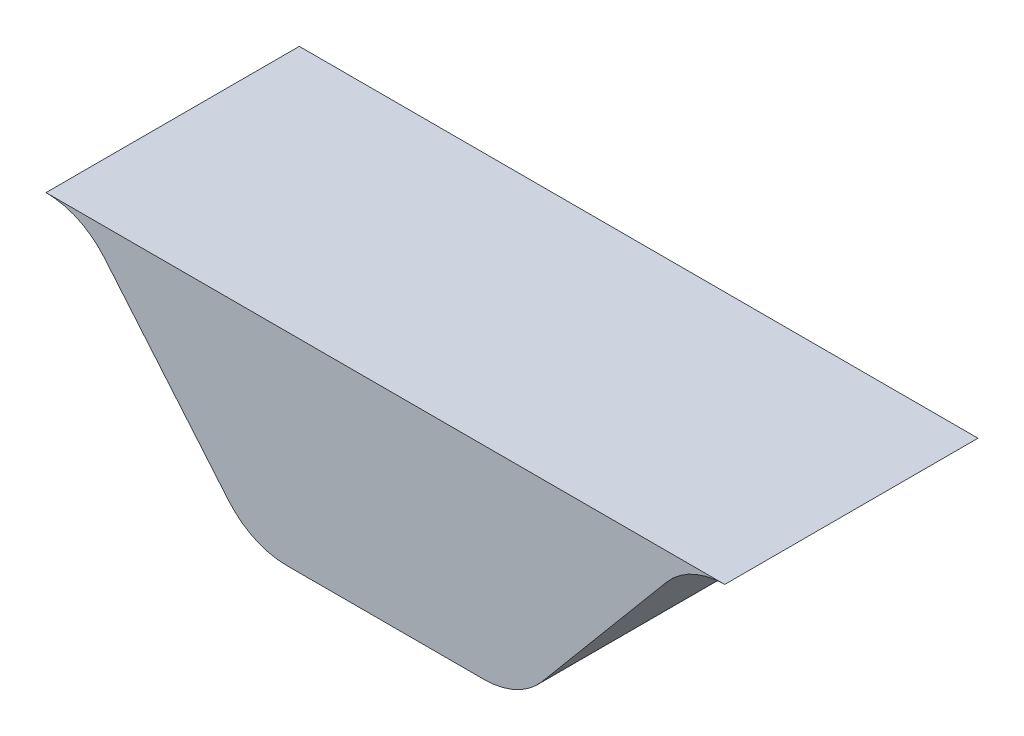
ISO-10303-21;
HEADER;
FILE_DESCRIPTION(('STEP AP214'),'2;1');
FILE_NAME('part.step','',(''),(''),'','','');
FILE_SCHEMA(('AUTOMOTIVE_DESIGN { 1 0 10303 214 1 1 1 1 }'));
ENDSEC;
DATA;
#1=APPLICATION_CONTEXT('core data for automotive mechanical design processes');
#2=APPLICATION_PROTOCOL_DEFINITION('international standard','automotive_design',2000,#1);
#3=PRODUCT_CONTEXT('',#1,'mechanical');
#4=PRODUCT('Part','Part','',(#3));
#5=PRODUCT_RELATED_PRODUCT_CATEGORY('part','',(#4));
#6=PRODUCT_DEFINITION_FORMATION('','',#4);
#7=PRODUCT_DEFINITION_CONTEXT('part definition',#1,'design');
#8=PRODUCT_DEFINITION('design','',#6,#7);
#9=PRODUCT_DEFINITION_SHAPE('','',#8);
#10=(LENGTH_UNIT() NAMED_UNIT(*) SI_UNIT(.MILLI.,.METRE.));
#11=(NAMED_UNIT(*) PLANE_ANGLE_UNIT() SI_UNIT($,.RADIAN.));
#12=(NAMED_UNIT(*) SI_UNIT($,.STERADIAN.) SOLID_ANGLE_UNIT());
#13=UNCERTAINTY_MEASURE_WITH_UNIT(LENGTH_MEASURE(1.E-05),#10,'distance_accuracy_value','');
#14=(GEOMETRIC_REPRESENTATION_CONTEXT(3) GLOBAL_UNCERTAINTY_ASSIGNED_CONTEXT((#13)) GLOBAL_UNIT_ASSIGNED_CONTEXT((#10,
#11,#12)) REPRESENTATION_CONTEXT('',''));
#15=CARTESIAN_POINT('',(0.,0.,0.));
#16=DIRECTION('',(0.,0.,1.));
#17=DIRECTION('',(1.,0.,0.));
#18=AXIS2_PLACEMENT_3D('',#15,#16,#17);
#19=CARTESIAN_POINT('',(2.64360147529084,-4.,2.5));
#20=DIRECTION('',(0.,1.,0.));
#21=DIRECTION('',(-1.,0.,0.));
#22=AXIS2_PLACEMENT_3D('',#19,#20,#21);
#23=PLANE('',#22);
#24=DIRECTION('',(1.,0.,0.));
#25=VECTOR('',#24,1.);
#26=CARTESIAN_POINT('',(2.64360147529084,-4.,-2.5));
#27=LINE('',#26,#25);
#28=CARTESIAN_POINT('',(-1.94413998805835,-4.,-2.5));
#29=VERTEX_POINT('',#28);
#30=CARTESIAN_POINT('',(1.94413998805835,-4.,-2.5));
#31=VERTEX_POINT('',#30);
#32=EDGE_CURVE('E164',#29,#31,#27,.T.);
#33=ORIENTED_EDGE('',*,*,#32,.T.);
#34=DIRECTION('',(0.,0.,-1.));
#35=VECTOR('',#34,1.);
#36=CARTESIAN_POINT('',(1.94413998805835,-4.,2.5));
#37=LINE('',#36,#35);
#38=CARTESIAN_POINT('',(1.94413998805835,-4.,2.5));
#39=VERTEX_POINT('',#38);
#40=EDGE_CURVE('E58',#31,#39,#37,.F.);
#41=ORIENTED_EDGE('',*,*,#40,.T.);
#42=DIRECTION('',(1.,0.,0.));
#43=VECTOR('',#42,1.);
#44=CARTESIAN_POINT('',(2.64360147529084,-4.,2.5));
#45=LINE('',#44,#43);
#46=CARTESIAN_POINT('',(-1.94413998805835,-4.,2.5));
#47=VERTEX_POINT('',#46);
#48=EDGE_CURVE('E170',#47,#39,#45,.T.);
#49=ORIENTED_EDGE('',*,*,#48,.F.);
#50=DIRECTION('',(0.,0.,-1.));
#51=VECTOR('',#50,1.);
#52=CARTESIAN_POINT('',(-1.94413998805835,-4.,2.5));
#53=LINE('',#52,#51);
#54=EDGE_CURVE('E143',#47,#29,#53,.T.);
#55=ORIENTED_EDGE('',*,*,#54,.T.);
#56=EDGE_LOOP('',(#33,#41,#49,#55));
#57=FACE_BOUND('',#56,.T.);
#58=CARTESIAN_POINT('',(0.,-4.,0.));
#59=DIRECTION('',(0.,1.,0.));
#60=DIRECTION('',(-1.,0.,0.));
#61=AXIS2_PLACEMENT_3D('',#58,#59,#60);
#62=CIRCLE('',#61,1.5);
#63=CARTESIAN_POINT('',(-1.5,-4.,0.));
#64=VERTEX_POINT('',#63);
#65=EDGE_CURVE('E12',#64,#64,#62,.F.);
#66=ORIENTED_EDGE('',*,*,#65,.F.);
#67=EDGE_LOOP('',(#66));
#68=FACE_BOUND('',#67,.T.);
#69=ADVANCED_FACE('F42',(#57,#68),#23,.F.);
#70=CARTESIAN_POINT('',(-2.64360147529084,-4.,2.5));
#71=DIRECTION('',(0.766044443118974,0.642787609686544,0.));
#72=DIRECTION('',(-0.642787609686544,0.766044443118974,0.));
#73=AXIS2_PLACEMENT_3D('',#70,#71,#72);
#74=PLANE('',#73);
#75=DIRECTION('',(0.642787609686544,-0.766044443118974,0.));
#76=VECTOR('',#75,1.);
#77=CARTESIAN_POINT('',(-2.64360147529084,-4.,2.5));
#78=LINE('',#77,#76);
#79=CARTESIAN_POINT('',(-5.55039482255403,-0.535818585470183,2.5));
#80=VERTEX_POINT('',#79);
#81=CARTESIAN_POINT('',(-3.09320665273681,-3.46418141452981,2.5));
#82=VERTEX_POINT('',#81);
#83=EDGE_CURVE('E160',#80,#82,#78,.T.);
#84=ORIENTED_EDGE('',*,*,#83,.F.);
#85=DIRECTION('',(0.,0.,-1.));
#86=VECTOR('',#85,1.);
#87=CARTESIAN_POINT('',(-5.55039482255403,-0.535818585470183,-2.5));
#88=LINE('',#87,#86);
#89=CARTESIAN_POINT('',(-5.55039482255403,-0.535818585470183,-2.5));
#90=VERTEX_POINT('',#89);
#91=EDGE_CURVE('E132',#80,#90,#88,.T.);
#92=ORIENTED_EDGE('',*,*,#91,.T.);
#93=DIRECTION('',(0.642787609686544,-0.766044443118974,0.));
#94=VECTOR('',#93,1.);
#95=CARTESIAN_POINT('',(-2.64360147529084,-4.,-2.5));
#96=LINE('',#95,#94);
#97=CARTESIAN_POINT('',(-3.09320665273681,-3.46418141452981,-2.5));
#98=VERTEX_POINT('',#97);
#99=EDGE_CURVE('E166',#90,#98,#96,.T.);
#100=ORIENTED_EDGE('',*,*,#99,.T.);
#101=DIRECTION('',(0.,0.,-1.));
#102=VECTOR('',#101,1.);
#103=CARTESIAN_POINT('',(-3.09320665273681,-3.46418141452981,2.5));
#104=LINE('',#103,#102);
#105=EDGE_CURVE('E151',#98,#82,#104,.F.);
#106=ORIENTED_EDGE('',*,*,#105,.T.);
#107=EDGE_LOOP('',(#84,#92,#100,#106));
#108=FACE_BOUND('',#107,.T.);
#109=ADVANCED_FACE('F193',(#108),#74,.F.);
#110=ORIENTED_EDGE('',*,*,#65,.T.);
#111=EDGE_LOOP('',(#110));
#112=FACE_BOUND('',#111,.T.);
#113=ADVANCED_FACE('F195',(#112),#23,.F.);
#114=CARTESIAN_POINT('',(6.,0.,2.5));
#115=DIRECTION('',(-0.766044443118975,0.642787609686543,0.));
#116=DIRECTION('',(-0.642787609686543,-0.766044443118975,0.));
#117=AXIS2_PLACEMENT_3D('',#114,#115,#116);
#118=PLANE('',#117);
#119=DIRECTION('',(0.642787609686543,0.766044443118975,0.));
#120=VECTOR('',#119,1.);
#121=CARTESIAN_POINT('',(6.,0.,-2.5));
#122=LINE('',#121,#120);
#123=CARTESIAN_POINT('',(3.09320665273681,-3.46418141452981,-2.5));
#124=VERTEX_POINT('',#123);
#125=CARTESIAN_POINT('',(5.55039482255403,-0.535818585470182,-2.5));
#126=VERTEX_POINT('',#125);
#127=EDGE_CURVE('E161',#124,#126,#122,.T.);
#128=ORIENTED_EDGE('',*,*,#127,.T.);
#129=DIRECTION('',(0.,0.,-1.));
#130=VECTOR('',#129,1.);
#131=CARTESIAN_POINT('',(5.55039482255403,-0.535818585470182,2.5));
#132=LINE('',#131,#130);
#133=CARTESIAN_POINT('',(5.55039482255403,-0.535818585470182,2.5));
#134=VERTEX_POINT('',#133);
#135=EDGE_CURVE('E153',#126,#134,#132,.F.);
#136=ORIENTED_EDGE('',*,*,#135,.T.);
#137=DIRECTION('',(0.642787609686543,0.766044443118975,0.));
#138=VECTOR('',#137,1.);
#139=CARTESIAN_POINT('',(6.,0.,2.5));
#140=LINE('',#139,#138);
#141=CARTESIAN_POINT('',(3.09320665273681,-3.46418141452981,2.5));
#142=VERTEX_POINT('',#141);
#143=EDGE_CURVE('E127',#142,#134,#140,.T.);
#144=ORIENTED_EDGE('',*,*,#143,.F.);
#145=DIRECTION('',(0.,0.,-1.));
#146=VECTOR('',#145,1.);
#147=CARTESIAN_POINT('',(3.09320665273681,-3.46418141452981,2.5));
#148=LINE('',#147,#146);
#149=EDGE_CURVE('E155',#142,#124,#148,.T.);
#150=ORIENTED_EDGE('',*,*,#149,.T.);
#151=EDGE_LOOP('',(#128,#136,#144,#150));
#152=FACE_BOUND('',#151,.T.);
#153=ADVANCED_FACE('F188',(#152),#118,.F.);
#154=CARTESIAN_POINT('',(0.,0.,2.5));
#155=DIRECTION('',(0.,0.,1.));
#156=DIRECTION('',(1.,0.,0.));
#157=AXIS2_PLACEMENT_3D('',#154,#155,#156);
#158=PLANE('',#157);
#159=ORIENTED_EDGE('',*,*,#48,.T.);
#160=CARTESIAN_POINT('',(1.94413998805835,-2.5,2.5));
#161=DIRECTION('',(0.,0.,1.));
#162=DIRECTION('',(1.,0.,0.));
#163=AXIS2_PLACEMENT_3D('',#160,#161,#162);
#164=CIRCLE('',#163,1.5);
#165=EDGE_CURVE('E139',#39,#142,#164,.T.);
#166=ORIENTED_EDGE('',*,*,#165,.T.);
#167=ORIENTED_EDGE('',*,*,#143,.T.);
#168=CARTESIAN_POINT('',(6.69946148723249,-1.5,2.5));
#169=DIRECTION('',(0.,0.,1.));
#170=DIRECTION('',(1.,0.,0.));
#171=AXIS2_PLACEMENT_3D('',#168,#169,#170);
#172=CIRCLE('',#171,1.5);
#173=CARTESIAN_POINT('',(6.69946148723249,0.,2.5));
#174=VERTEX_POINT('',#173);
#175=EDGE_CURVE('E125',#134,#174,#172,.F.);
#176=ORIENTED_EDGE('',*,*,#175,.T.);
#177=DIRECTION('',(-1.,0.,0.));
#178=VECTOR('',#177,1.);
#179=CARTESIAN_POINT('',(-6.,0.,2.5));
#180=LINE('',#179,#178);
#181=CARTESIAN_POINT('',(-6.69946148723249,0.,2.5));
#182=VERTEX_POINT('',#181);
#183=EDGE_CURVE('E112',#174,#182,#180,.T.);
#184=ORIENTED_EDGE('',*,*,#183,.T.);
#185=CARTESIAN_POINT('',(-6.69946148723249,-1.5,2.5));
#186=DIRECTION('',(0.,0.,1.));
#187=DIRECTION('',(1.,0.,0.));
#188=AXIS2_PLACEMENT_3D('',#185,#186,#187);
#189=CIRCLE('',#188,1.5);
#190=EDGE_CURVE('E51',#182,#80,#189,.F.);
#191=ORIENTED_EDGE('',*,*,#190,.T.);
#192=ORIENTED_EDGE('',*,*,#83,.T.);
#193=CARTESIAN_POINT('',(-1.94413998805835,-2.5,2.5));
#194=DIRECTION('',(0.,0.,1.));
#195=DIRECTION('',(1.,0.,0.));
#196=AXIS2_PLACEMENT_3D('',#193,#194,#195);
#197=CIRCLE('',#196,1.5);
#198=EDGE_CURVE('E65',#82,#47,#197,.T.);
#199=ORIENTED_EDGE('',*,*,#198,.T.);
#200=EDGE_LOOP('',(#159,#166,#167,#176,#184,#191,#192,#199));
#201=FACE_BOUND('',#200,.T.);
#202=ADVANCED_FACE('F121',(#201),#158,.T.);
#203=CARTESIAN_POINT('',(0.,0.,-2.5));
#204=DIRECTION('',(0.,0.,1.));
#205=DIRECTION('',(1.,0.,0.));
#206=AXIS2_PLACEMENT_3D('',#203,#204,#205);
#207=PLANE('',#206);
#208=ORIENTED_EDGE('',*,*,#127,.F.);
#209=CARTESIAN_POINT('',(1.94413998805835,-2.5,-2.5));
#210=DIRECTION('',(0.,0.,1.));
#211=DIRECTION('',(1.,0.,0.));
#212=AXIS2_PLACEMENT_3D('',#209,#210,#211);
#213=CIRCLE('',#212,1.5);
#214=EDGE_CURVE('E146',#124,#31,#213,.F.);
#215=ORIENTED_EDGE('',*,*,#214,.T.);
#216=ORIENTED_EDGE('',*,*,#32,.F.);
#217=CARTESIAN_POINT('',(-1.94413998805835,-2.5,-2.5));
#218=DIRECTION('',(0.,0.,1.));
#219=DIRECTION('',(1.,0.,0.));
#220=AXIS2_PLACEMENT_3D('',#217,#218,#219);
#221=CIRCLE('',#220,1.5);
#222=EDGE_CURVE('E148',#29,#98,#221,.F.);
#223=ORIENTED_EDGE('',*,*,#222,.T.);
#224=ORIENTED_EDGE('',*,*,#99,.F.);
#225=CARTESIAN_POINT('',(-6.69946148723249,-1.5,-2.5));
#226=DIRECTION('',(0.,0.,1.));
#227=DIRECTION('',(1.,0.,0.));
#228=AXIS2_PLACEMENT_3D('',#225,#226,#227);
#229=CIRCLE('',#228,1.5);
#230=CARTESIAN_POINT('',(-6.69946148723249,0.,-2.5));
#231=VERTEX_POINT('',#230);
#232=EDGE_CURVE('E133',#90,#231,#229,.T.);
#233=ORIENTED_EDGE('',*,*,#232,.T.);
#234=DIRECTION('',(-1.,0.,0.));
#235=VECTOR('',#234,1.);
#236=CARTESIAN_POINT('',(-6.,0.,-2.5));
#237=LINE('',#236,#235);
#238=CARTESIAN_POINT('',(6.69946148723249,0.,-2.5));
#239=VERTEX_POINT('',#238);
#240=EDGE_CURVE('E115',#239,#231,#237,.T.);
#241=ORIENTED_EDGE('',*,*,#240,.F.);
#242=CARTESIAN_POINT('',(6.69946148723249,-1.5,-2.5));
#243=DIRECTION('',(0.,0.,1.));
#244=DIRECTION('',(1.,0.,0.));
#245=AXIS2_PLACEMENT_3D('',#242,#243,#244);
#246=CIRCLE('',#245,1.5);
#247=EDGE_CURVE('E137',#239,#126,#246,.T.);
#248=ORIENTED_EDGE('',*,*,#247,.T.);
#249=EDGE_LOOP('',(#208,#215,#216,#223,#224,#233,#241,#248));
#250=FACE_BOUND('',#249,.T.);
#251=ADVANCED_FACE('F180',(#250),#207,.F.);
#252=CARTESIAN_POINT('',(6.69946148723249,-1.5,25.));
#253=DIRECTION('',(0.,0.,1.));
#254=DIRECTION('',(1.,0.,0.));
#255=AXIS2_PLACEMENT_3D('',#252,#253,#254);
#256=CYLINDRICAL_SURFACE('',#255,1.5);
#257=ORIENTED_EDGE('',*,*,#175,.F.);
#258=ORIENTED_EDGE('',*,*,#135,.F.);
#259=ORIENTED_EDGE('',*,*,#247,.F.);
#260=DIRECTION('',(0.,0.,-1.));
#261=VECTOR('',#260,1.);
#262=CARTESIAN_POINT('',(6.69946148723249,0.,-2.5));
#263=LINE('',#262,#261);
#264=EDGE_CURVE('E119',#174,#239,#263,.T.);
#265=ORIENTED_EDGE('',*,*,#264,.F.);
#266=EDGE_LOOP('',(#257,#258,#259,#265));
#267=FACE_BOUND('',#266,.T.);
#268=ADVANCED_FACE('F191',(#267),#256,.F.);
#269=CARTESIAN_POINT('',(-6.69946148723249,-1.5,2.5));
#270=DIRECTION('',(0.,0.,1.));
#271=DIRECTION('',(1.,0.,0.));
#272=AXIS2_PLACEMENT_3D('',#269,#270,#271);
#273=CYLINDRICAL_SURFACE('',#272,1.5);
#274=ORIENTED_EDGE('',*,*,#190,.F.);
#275=DIRECTION('',(0.,0.,-1.));
#276=VECTOR('',#275,1.);
#277=CARTESIAN_POINT('',(-6.69946148723249,0.,2.5));
#278=LINE('',#277,#276);
#279=EDGE_CURVE('E109',#231,#182,#278,.F.);
#280=ORIENTED_EDGE('',*,*,#279,.F.);
#281=ORIENTED_EDGE('',*,*,#232,.F.);
#282=ORIENTED_EDGE('',*,*,#91,.F.);
#283=EDGE_LOOP('',(#274,#280,#281,#282));
#284=FACE_BOUND('',#283,.T.);
#285=ADVANCED_FACE('F130',(#284),#273,.F.);
#286=CARTESIAN_POINT('',(1.94413998805835,-2.5,2.5));
#287=DIRECTION('',(0.,0.,-1.));
#288=DIRECTION('',(-1.,0.,0.));
#289=AXIS2_PLACEMENT_3D('',#286,#287,#288);
#290=CYLINDRICAL_SURFACE('',#289,1.5);
#291=ORIENTED_EDGE('',*,*,#165,.F.);
#292=ORIENTED_EDGE('',*,*,#40,.F.);
#293=ORIENTED_EDGE('',*,*,#214,.F.);
#294=ORIENTED_EDGE('',*,*,#149,.F.);
#295=EDGE_LOOP('',(#291,#292,#293,#294));
#296=FACE_BOUND('',#295,.T.);
#297=ADVANCED_FACE('F185',(#296),#290,.T.);
#298=CARTESIAN_POINT('',(-1.94413998805835,-2.5,2.5));
#299=DIRECTION('',(0.,0.,-1.));
#300=DIRECTION('',(-1.,0.,0.));
#301=AXIS2_PLACEMENT_3D('',#298,#299,#300);
#302=CYLINDRICAL_SURFACE('',#301,1.5);
#303=ORIENTED_EDGE('',*,*,#198,.F.);
#304=ORIENTED_EDGE('',*,*,#105,.F.);
#305=ORIENTED_EDGE('',*,*,#222,.F.);
#306=ORIENTED_EDGE('',*,*,#54,.F.);
#307=EDGE_LOOP('',(#303,#304,#305,#306));
#308=FACE_BOUND('',#307,.T.);
#309=ADVANCED_FACE('F44',(#308),#302,.T.);
#310=CARTESIAN_POINT('',(25.,0.,25.));
#311=DIRECTION('',(0.,-1.,0.));
#312=DIRECTION('',(0.,0.,-1.));
#313=AXIS2_PLACEMENT_3D('',#310,#311,#312);
#314=PLANE('',#313);
#315=ORIENTED_EDGE('',*,*,#264,.T.);
#316=ORIENTED_EDGE('',*,*,#240,.T.);
#317=ORIENTED_EDGE('',*,*,#279,.T.);
#318=ORIENTED_EDGE('',*,*,#183,.F.);
#319=EDGE_LOOP('',(#315,#316,#317,#318));
#320=FACE_BOUND('',#319,.T.);
#321=ADVANCED_FACE('F111',(#320),#314,.F.);
#322=CLOSED_SHELL('',(#69,#109,#113,#153,#202,#251,#268,#285,#297,#309,#321));
#323=MANIFOLD_SOLID_BREP('B2',#322);
#324=ADVANCED_BREP_SHAPE_REPRESENTATION('',(#18,#323),#14);
#325=SHAPE_DEFINITION_REPRESENTATION(#9,#324);
ENDSEC;
END-ISO-10303-21;
